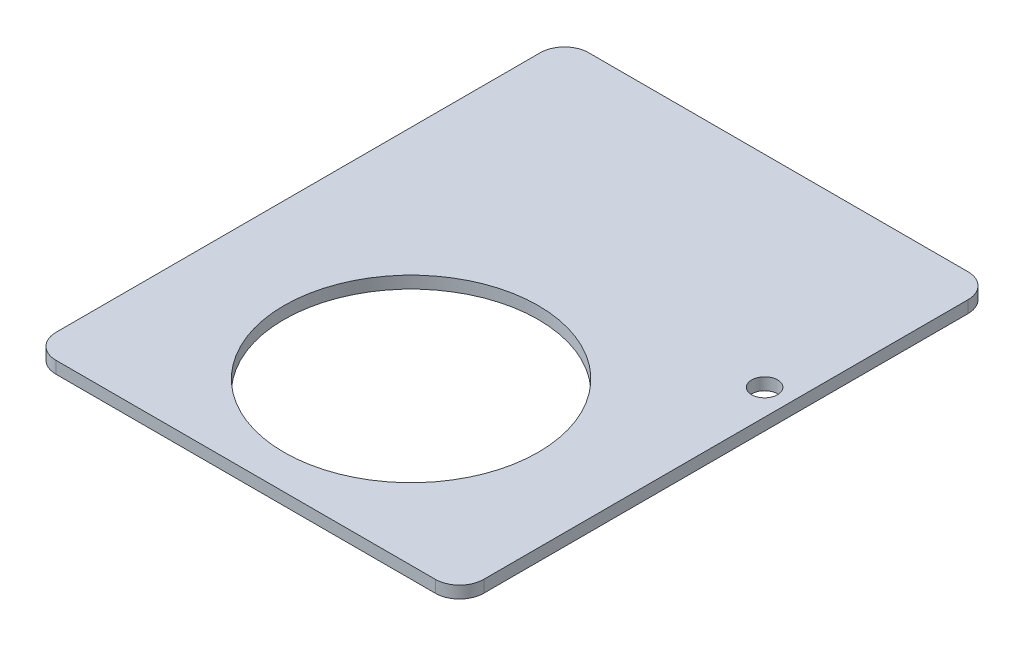
ISO-10303-21;
HEADER;
FILE_DESCRIPTION(('STEP AP214'),'2;1');
FILE_NAME('part.step','',(''),(''),'','','');
FILE_SCHEMA(('AUTOMOTIVE_DESIGN { 1 0 10303 214 1 1 1 1 }'));
ENDSEC;
DATA;
#1=APPLICATION_CONTEXT('core data for automotive mechanical design processes');
#2=APPLICATION_PROTOCOL_DEFINITION('international standard','automotive_design',2000,#1);
#3=PRODUCT_CONTEXT('',#1,'mechanical');
#4=PRODUCT('Part','Part','',(#3));
#5=PRODUCT_RELATED_PRODUCT_CATEGORY('part','',(#4));
#6=PRODUCT_DEFINITION_FORMATION('','',#4);
#7=PRODUCT_DEFINITION_CONTEXT('part definition',#1,'design');
#8=PRODUCT_DEFINITION('design','',#6,#7);
#9=PRODUCT_DEFINITION_SHAPE('','',#8);
#10=(LENGTH_UNIT() NAMED_UNIT(*) SI_UNIT(.MILLI.,.METRE.));
#11=(NAMED_UNIT(*) PLANE_ANGLE_UNIT() SI_UNIT($,.RADIAN.));
#12=(NAMED_UNIT(*) SI_UNIT($,.STERADIAN.) SOLID_ANGLE_UNIT());
#13=UNCERTAINTY_MEASURE_WITH_UNIT(LENGTH_MEASURE(1.E-05),#10,'distance_accuracy_value','');
#14=(GEOMETRIC_REPRESENTATION_CONTEXT(3) GLOBAL_UNCERTAINTY_ASSIGNED_CONTEXT((#13)) GLOBAL_UNIT_ASSIGNED_CONTEXT((#10,
#11,#12)) REPRESENTATION_CONTEXT('',''));
#15=CARTESIAN_POINT('',(0.,0.,0.));
#16=DIRECTION('',(0.,0.,1.));
#17=DIRECTION('',(1.,0.,0.));
#18=AXIS2_PLACEMENT_3D('',#15,#16,#17);
#19=CARTESIAN_POINT('',(-17.8909192247391,1.5,15.8487642961621));
#20=DIRECTION('',(0.,1.,0.));
#21=DIRECTION('',(0.,0.,1.));
#22=AXIS2_PLACEMENT_3D('',#19,#20,#21);
#23=PLANE('',#22);
#24=CARTESIAN_POINT('',(6.1090807752609,1.5,-1.15123570383793));
#25=DIRECTION('',(0.,1.,0.));
#26=DIRECTION('',(0.,0.,1.));
#27=AXIS2_PLACEMENT_3D('',#24,#25,#26);
#28=CIRCLE('',#27,15.75);
#29=CARTESIAN_POINT('',(6.1090807752609,1.5,14.5987642961621));
#30=VERTEX_POINT('',#29);
#31=EDGE_CURVE('E134',#30,#30,#28,.T.);
#32=ORIENTED_EDGE('',*,*,#31,.F.);
#33=EDGE_LOOP('',(#32));
#34=FACE_BOUND('',#33,.T.);
#35=CARTESIAN_POINT('',(-17.8909192247391,1.5,15.8487642961621));
#36=DIRECTION('',(0.,1.,0.));
#37=DIRECTION('',(0.,0.,1.));
#38=AXIS2_PLACEMENT_3D('',#35,#36,#37);
#39=CIRCLE('',#38,3.);
#40=CARTESIAN_POINT('',(-20.8909192247391,1.5,15.8487642961621));
#41=VERTEX_POINT('',#40);
#42=CARTESIAN_POINT('',(-17.8909192247391,1.5,18.8487642961621));
#43=VERTEX_POINT('',#42);
#44=EDGE_CURVE('E145',#41,#43,#39,.T.);
#45=ORIENTED_EDGE('',*,*,#44,.T.);
#46=DIRECTION('',(1.,0.,0.));
#47=VECTOR('',#46,1.);
#48=CARTESIAN_POINT('',(-17.8909192247391,1.5,18.8487642961621));
#49=LINE('',#48,#47);
#50=CARTESIAN_POINT('',(29.1090807752609,1.5,18.8487642961621));
#51=VERTEX_POINT('',#50);
#52=EDGE_CURVE('E93',#43,#51,#49,.T.);
#53=ORIENTED_EDGE('',*,*,#52,.T.);
#54=CARTESIAN_POINT('',(29.1090807752609,1.5,15.8487642961621));
#55=DIRECTION('',(0.,1.,0.));
#56=DIRECTION('',(0.,0.,1.));
#57=AXIS2_PLACEMENT_3D('',#54,#55,#56);
#58=CIRCLE('',#57,3.);
#59=CARTESIAN_POINT('',(32.1090807752609,1.5,15.8487642961621));
#60=VERTEX_POINT('',#59);
#61=EDGE_CURVE('E160',#51,#60,#58,.T.);
#62=ORIENTED_EDGE('',*,*,#61,.T.);
#63=DIRECTION('',(0.,0.,-1.));
#64=VECTOR('',#63,1.);
#65=CARTESIAN_POINT('',(32.1090807752609,1.5,-44.1512357038379));
#66=LINE('',#65,#64);
#67=CARTESIAN_POINT('',(32.1090807752609,1.5,-44.1512357038379));
#68=VERTEX_POINT('',#67);
#69=EDGE_CURVE('E173',#60,#68,#66,.T.);
#70=ORIENTED_EDGE('',*,*,#69,.T.);
#71=CARTESIAN_POINT('',(29.1090807752609,1.5,-44.1512357038379));
#72=DIRECTION('',(0.,1.,0.));
#73=DIRECTION('',(0.,0.,1.));
#74=AXIS2_PLACEMENT_3D('',#71,#72,#73);
#75=CIRCLE('',#74,3.);
#76=CARTESIAN_POINT('',(29.1090807752609,1.5,-47.1512357038379));
#77=VERTEX_POINT('',#76);
#78=EDGE_CURVE('E112',#68,#77,#75,.T.);
#79=ORIENTED_EDGE('',*,*,#78,.T.);
#80=DIRECTION('',(-1.,0.,0.));
#81=VECTOR('',#80,1.);
#82=CARTESIAN_POINT('',(-17.8909192247391,1.5,-47.1512357038379));
#83=LINE('',#82,#81);
#84=CARTESIAN_POINT('',(-17.8909192247391,1.5,-47.1512357038379));
#85=VERTEX_POINT('',#84);
#86=EDGE_CURVE('E106',#77,#85,#83,.T.);
#87=ORIENTED_EDGE('',*,*,#86,.T.);
#88=CARTESIAN_POINT('',(-17.8909192247391,1.5,-44.1512357038379));
#89=DIRECTION('',(0.,1.,0.));
#90=DIRECTION('',(0.,0.,1.));
#91=AXIS2_PLACEMENT_3D('',#88,#89,#90);
#92=CIRCLE('',#91,3.);
#93=CARTESIAN_POINT('',(-20.8909192247391,1.5,-44.1512357038379));
#94=VERTEX_POINT('',#93);
#95=EDGE_CURVE('E110',#85,#94,#92,.T.);
#96=ORIENTED_EDGE('',*,*,#95,.T.);
#97=DIRECTION('',(0.,0.,1.));
#98=VECTOR('',#97,1.);
#99=CARTESIAN_POINT('',(-20.8909192247391,1.5,-44.1512357038379));
#100=LINE('',#99,#98);
#101=EDGE_CURVE('E50',#94,#41,#100,.T.);
#102=ORIENTED_EDGE('',*,*,#101,.T.);
#103=EDGE_LOOP('',(#45,#53,#62,#70,#79,#87,#96,#102));
#104=FACE_BOUND('',#103,.T.);
#105=CARTESIAN_POINT('',(28.9090807752609,1.5,-22.1512357038379));
#106=DIRECTION('',(0.,1.,0.));
#107=DIRECTION('',(0.,0.,1.));
#108=AXIS2_PLACEMENT_3D('',#105,#106,#107);
#109=CIRCLE('',#108,1.60000000000001);
#110=CARTESIAN_POINT('',(28.9090807752609,1.5,-20.5512357038379));
#111=VERTEX_POINT('',#110);
#112=EDGE_CURVE('E182',#111,#111,#109,.T.);
#113=ORIENTED_EDGE('',*,*,#112,.F.);
#114=EDGE_LOOP('',(#113));
#115=FACE_BOUND('',#114,.T.);
#116=ADVANCED_FACE('F33',(#34,#104,#115),#23,.T.);
#117=CARTESIAN_POINT('',(-17.8909192247391,0.,15.8487642961621));
#118=DIRECTION('',(0.,1.,0.));
#119=DIRECTION('',(0.,0.,1.));
#120=AXIS2_PLACEMENT_3D('',#117,#118,#119);
#121=PLANE('',#120);
#122=CARTESIAN_POINT('',(-17.8909192247391,0.,15.8487642961621));
#123=DIRECTION('',(0.,1.,0.));
#124=DIRECTION('',(0.,0.,1.));
#125=AXIS2_PLACEMENT_3D('',#122,#123,#124);
#126=CIRCLE('',#125,3.);
#127=CARTESIAN_POINT('',(-20.8909192247391,0.,15.8487642961621));
#128=VERTEX_POINT('',#127);
#129=CARTESIAN_POINT('',(-17.8909192247391,0.,18.8487642961621));
#130=VERTEX_POINT('',#129);
#131=EDGE_CURVE('E130',#128,#130,#126,.T.);
#132=ORIENTED_EDGE('',*,*,#131,.F.);
#133=DIRECTION('',(0.,0.,1.));
#134=VECTOR('',#133,1.);
#135=CARTESIAN_POINT('',(-20.8909192247391,0.,-44.1512357038379));
#136=LINE('',#135,#134);
#137=CARTESIAN_POINT('',(-20.8909192247391,0.,-44.1512357038379));
#138=VERTEX_POINT('',#137);
#139=EDGE_CURVE('E85',#138,#128,#136,.T.);
#140=ORIENTED_EDGE('',*,*,#139,.F.);
#141=CARTESIAN_POINT('',(-17.8909192247391,0.,-44.1512357038379));
#142=DIRECTION('',(0.,1.,0.));
#143=DIRECTION('',(0.,0.,1.));
#144=AXIS2_PLACEMENT_3D('',#141,#142,#143);
#145=CIRCLE('',#144,3.);
#146=CARTESIAN_POINT('',(-17.8909192247391,0.,-47.1512357038379));
#147=VERTEX_POINT('',#146);
#148=EDGE_CURVE('E79',#147,#138,#145,.T.);
#149=ORIENTED_EDGE('',*,*,#148,.F.);
#150=DIRECTION('',(-1.,0.,0.));
#151=VECTOR('',#150,1.);
#152=CARTESIAN_POINT('',(-17.8909192247391,0.,-47.1512357038379));
#153=LINE('',#152,#151);
#154=CARTESIAN_POINT('',(29.1090807752609,0.,-47.1512357038379));
#155=VERTEX_POINT('',#154);
#156=EDGE_CURVE('E120',#155,#147,#153,.T.);
#157=ORIENTED_EDGE('',*,*,#156,.F.);
#158=CARTESIAN_POINT('',(29.1090807752609,0.,-44.1512357038379));
#159=DIRECTION('',(0.,1.,0.));
#160=DIRECTION('',(0.,0.,1.));
#161=AXIS2_PLACEMENT_3D('',#158,#159,#160);
#162=CIRCLE('',#161,3.);
#163=CARTESIAN_POINT('',(32.1090807752609,0.,-44.1512357038379));
#164=VERTEX_POINT('',#163);
#165=EDGE_CURVE('E140',#164,#155,#162,.T.);
#166=ORIENTED_EDGE('',*,*,#165,.F.);
#167=DIRECTION('',(0.,0.,-1.));
#168=VECTOR('',#167,1.);
#169=CARTESIAN_POINT('',(32.1090807752609,0.,-44.1512357038379));
#170=LINE('',#169,#168);
#171=CARTESIAN_POINT('',(32.1090807752609,0.,15.8487642961621));
#172=VERTEX_POINT('',#171);
#173=EDGE_CURVE('E138',#172,#164,#170,.T.);
#174=ORIENTED_EDGE('',*,*,#173,.F.);
#175=CARTESIAN_POINT('',(29.1090807752609,0.,15.8487642961621));
#176=DIRECTION('',(0.,1.,0.));
#177=DIRECTION('',(0.,0.,1.));
#178=AXIS2_PLACEMENT_3D('',#175,#176,#177);
#179=CIRCLE('',#178,3.);
#180=CARTESIAN_POINT('',(29.1090807752609,0.,18.8487642961621));
#181=VERTEX_POINT('',#180);
#182=EDGE_CURVE('E136',#181,#172,#179,.T.);
#183=ORIENTED_EDGE('',*,*,#182,.F.);
#184=DIRECTION('',(1.,0.,0.));
#185=VECTOR('',#184,1.);
#186=CARTESIAN_POINT('',(-17.8909192247391,0.,18.8487642961621));
#187=LINE('',#186,#185);
#188=EDGE_CURVE('E133',#130,#181,#187,.T.);
#189=ORIENTED_EDGE('',*,*,#188,.F.);
#190=EDGE_LOOP('',(#132,#140,#149,#157,#166,#174,#183,#189));
#191=FACE_BOUND('',#190,.T.);
#192=CARTESIAN_POINT('',(6.1090807752609,0.,-1.15123570383793));
#193=DIRECTION('',(0.,1.,0.));
#194=DIRECTION('',(0.,0.,1.));
#195=AXIS2_PLACEMENT_3D('',#192,#193,#194);
#196=CIRCLE('',#195,15.75);
#197=CARTESIAN_POINT('',(6.1090807752609,0.,14.5987642961621));
#198=VERTEX_POINT('',#197);
#199=EDGE_CURVE('E179',#198,#198,#196,.T.);
#200=ORIENTED_EDGE('',*,*,#199,.T.);
#201=EDGE_LOOP('',(#200));
#202=FACE_BOUND('',#201,.T.);
#203=CARTESIAN_POINT('',(28.9090807752609,0.,-22.1512357038379));
#204=DIRECTION('',(0.,1.,0.));
#205=DIRECTION('',(0.,0.,1.));
#206=AXIS2_PLACEMENT_3D('',#203,#204,#205);
#207=CIRCLE('',#206,1.60000000000001);
#208=CARTESIAN_POINT('',(28.9090807752609,0.,-20.5512357038379));
#209=VERTEX_POINT('',#208);
#210=EDGE_CURVE('E185',#209,#209,#207,.T.);
#211=ORIENTED_EDGE('',*,*,#210,.T.);
#212=EDGE_LOOP('',(#211));
#213=FACE_BOUND('',#212,.T.);
#214=ADVANCED_FACE('F164',(#191,#202,#213),#121,.F.);
#215=CARTESIAN_POINT('',(-17.8909192247391,1.5,15.8487642961621));
#216=DIRECTION('',(0.,-1.,0.));
#217=DIRECTION('',(0.,0.,-1.));
#218=AXIS2_PLACEMENT_3D('',#215,#216,#217);
#219=CYLINDRICAL_SURFACE('',#218,3.);
#220=ORIENTED_EDGE('',*,*,#131,.T.);
#221=DIRECTION('',(0.,-1.,0.));
#222=VECTOR('',#221,1.);
#223=CARTESIAN_POINT('',(-17.8909192247391,1.5,18.8487642961621));
#224=LINE('',#223,#222);
#225=EDGE_CURVE('E11',#43,#130,#224,.T.);
#226=ORIENTED_EDGE('',*,*,#225,.F.);
#227=ORIENTED_EDGE('',*,*,#44,.F.);
#228=DIRECTION('',(0.,-1.,0.));
#229=VECTOR('',#228,1.);
#230=CARTESIAN_POINT('',(-20.8909192247391,1.5,15.8487642961621));
#231=LINE('',#230,#229);
#232=EDGE_CURVE('E126',#41,#128,#231,.T.);
#233=ORIENTED_EDGE('',*,*,#232,.T.);
#234=EDGE_LOOP('',(#220,#226,#227,#233));
#235=FACE_BOUND('',#234,.T.);
#236=ADVANCED_FACE('F35',(#235),#219,.T.);
#237=CARTESIAN_POINT('',(-17.8909192247391,1.5,18.8487642961621));
#238=DIRECTION('',(0.,0.,-1.));
#239=DIRECTION('',(-1.,0.,0.));
#240=AXIS2_PLACEMENT_3D('',#237,#238,#239);
#241=PLANE('',#240);
#242=ORIENTED_EDGE('',*,*,#188,.T.);
#243=DIRECTION('',(0.,-1.,0.));
#244=VECTOR('',#243,1.);
#245=CARTESIAN_POINT('',(29.1090807752609,1.5,18.8487642961621));
#246=LINE('',#245,#244);
#247=EDGE_CURVE('E42',#51,#181,#246,.T.);
#248=ORIENTED_EDGE('',*,*,#247,.F.);
#249=ORIENTED_EDGE('',*,*,#52,.F.);
#250=ORIENTED_EDGE('',*,*,#225,.T.);
#251=EDGE_LOOP('',(#242,#248,#249,#250));
#252=FACE_BOUND('',#251,.T.);
#253=ADVANCED_FACE('F217',(#252),#241,.F.);
#254=CARTESIAN_POINT('',(29.1090807752609,1.5,15.8487642961621));
#255=DIRECTION('',(0.,-1.,0.));
#256=DIRECTION('',(0.,0.,-1.));
#257=AXIS2_PLACEMENT_3D('',#254,#255,#256);
#258=CYLINDRICAL_SURFACE('',#257,3.);
#259=ORIENTED_EDGE('',*,*,#182,.T.);
#260=DIRECTION('',(0.,-1.,0.));
#261=VECTOR('',#260,1.);
#262=CARTESIAN_POINT('',(32.1090807752609,1.5,15.8487642961621));
#263=LINE('',#262,#261);
#264=EDGE_CURVE('E152',#60,#172,#263,.T.);
#265=ORIENTED_EDGE('',*,*,#264,.F.);
#266=ORIENTED_EDGE('',*,*,#61,.F.);
#267=ORIENTED_EDGE('',*,*,#247,.T.);
#268=EDGE_LOOP('',(#259,#265,#266,#267));
#269=FACE_BOUND('',#268,.T.);
#270=ADVANCED_FACE('F158',(#269),#258,.T.);
#271=CARTESIAN_POINT('',(32.1090807752609,1.5,-44.1512357038379));
#272=DIRECTION('',(-1.,0.,0.));
#273=DIRECTION('',(0.,0.,1.));
#274=AXIS2_PLACEMENT_3D('',#271,#272,#273);
#275=PLANE('',#274);
#276=ORIENTED_EDGE('',*,*,#173,.T.);
#277=DIRECTION('',(0.,-1.,0.));
#278=VECTOR('',#277,1.);
#279=CARTESIAN_POINT('',(32.1090807752609,1.5,-44.1512357038379));
#280=LINE('',#279,#278);
#281=EDGE_CURVE('E149',#68,#164,#280,.T.);
#282=ORIENTED_EDGE('',*,*,#281,.F.);
#283=ORIENTED_EDGE('',*,*,#69,.F.);
#284=ORIENTED_EDGE('',*,*,#264,.T.);
#285=EDGE_LOOP('',(#276,#282,#283,#284));
#286=FACE_BOUND('',#285,.T.);
#287=ADVANCED_FACE('F169',(#286),#275,.F.);
#288=CARTESIAN_POINT('',(29.1090807752609,1.5,-44.1512357038379));
#289=DIRECTION('',(0.,-1.,0.));
#290=DIRECTION('',(0.,0.,-1.));
#291=AXIS2_PLACEMENT_3D('',#288,#289,#290);
#292=CYLINDRICAL_SURFACE('',#291,3.);
#293=ORIENTED_EDGE('',*,*,#165,.T.);
#294=DIRECTION('',(0.,-1.,0.));
#295=VECTOR('',#294,1.);
#296=CARTESIAN_POINT('',(29.1090807752609,1.5,-47.1512357038379));
#297=LINE('',#296,#295);
#298=EDGE_CURVE('E121',#77,#155,#297,.T.);
#299=ORIENTED_EDGE('',*,*,#298,.F.);
#300=ORIENTED_EDGE('',*,*,#78,.F.);
#301=ORIENTED_EDGE('',*,*,#281,.T.);
#302=EDGE_LOOP('',(#293,#299,#300,#301));
#303=FACE_BOUND('',#302,.T.);
#304=ADVANCED_FACE('F172',(#303),#292,.T.);
#305=CARTESIAN_POINT('',(-17.8909192247391,1.5,-47.1512357038379));
#306=DIRECTION('',(0.,0.,1.));
#307=DIRECTION('',(1.,0.,0.));
#308=AXIS2_PLACEMENT_3D('',#305,#306,#307);
#309=PLANE('',#308);
#310=ORIENTED_EDGE('',*,*,#156,.T.);
#311=DIRECTION('',(0.,-1.,0.));
#312=VECTOR('',#311,1.);
#313=CARTESIAN_POINT('',(-17.8909192247391,1.5,-47.1512357038379));
#314=LINE('',#313,#312);
#315=EDGE_CURVE('E117',#85,#147,#314,.T.);
#316=ORIENTED_EDGE('',*,*,#315,.F.);
#317=ORIENTED_EDGE('',*,*,#86,.F.);
#318=ORIENTED_EDGE('',*,*,#298,.T.);
#319=EDGE_LOOP('',(#310,#316,#317,#318));
#320=FACE_BOUND('',#319,.T.);
#321=ADVANCED_FACE('F118',(#320),#309,.F.);
#322=CARTESIAN_POINT('',(-17.8909192247391,1.5,-44.1512357038379));
#323=DIRECTION('',(0.,-1.,0.));
#324=DIRECTION('',(0.,0.,-1.));
#325=AXIS2_PLACEMENT_3D('',#322,#323,#324);
#326=CYLINDRICAL_SURFACE('',#325,3.);
#327=ORIENTED_EDGE('',*,*,#148,.T.);
#328=DIRECTION('',(0.,-1.,0.));
#329=VECTOR('',#328,1.);
#330=CARTESIAN_POINT('',(-20.8909192247391,1.5,-44.1512357038379));
#331=LINE('',#330,#329);
#332=EDGE_CURVE('E122',#94,#138,#331,.T.);
#333=ORIENTED_EDGE('',*,*,#332,.F.);
#334=ORIENTED_EDGE('',*,*,#95,.F.);
#335=ORIENTED_EDGE('',*,*,#315,.T.);
#336=EDGE_LOOP('',(#327,#333,#334,#335));
#337=FACE_BOUND('',#336,.T.);
#338=ADVANCED_FACE('F124',(#337),#326,.T.);
#339=CARTESIAN_POINT('',(-20.8909192247391,1.5,-44.1512357038379));
#340=DIRECTION('',(1.,0.,0.));
#341=DIRECTION('',(0.,0.,-1.));
#342=AXIS2_PLACEMENT_3D('',#339,#340,#341);
#343=PLANE('',#342);
#344=ORIENTED_EDGE('',*,*,#139,.T.);
#345=ORIENTED_EDGE('',*,*,#232,.F.);
#346=ORIENTED_EDGE('',*,*,#101,.F.);
#347=ORIENTED_EDGE('',*,*,#332,.T.);
#348=EDGE_LOOP('',(#344,#345,#346,#347));
#349=FACE_BOUND('',#348,.T.);
#350=ADVANCED_FACE('F205',(#349),#343,.F.);
#351=CARTESIAN_POINT('',(6.1090807752609,1.5,-1.15123570383793));
#352=DIRECTION('',(0.,-1.,0.));
#353=DIRECTION('',(0.,0.,-1.));
#354=AXIS2_PLACEMENT_3D('',#351,#352,#353);
#355=CYLINDRICAL_SURFACE('',#354,15.75);
#356=ORIENTED_EDGE('',*,*,#31,.T.);
#357=EDGE_LOOP('',(#356));
#358=FACE_BOUND('',#357,.T.);
#359=ORIENTED_EDGE('',*,*,#199,.F.);
#360=EDGE_LOOP('',(#359));
#361=FACE_BOUND('',#360,.T.);
#362=ADVANCED_FACE('F202',(#358,#361),#355,.F.);
#363=CARTESIAN_POINT('',(28.9090807752609,1.5,-22.1512357038379));
#364=DIRECTION('',(0.,-1.,0.));
#365=DIRECTION('',(0.,0.,-1.));
#366=AXIS2_PLACEMENT_3D('',#363,#364,#365);
#367=CYLINDRICAL_SURFACE('',#366,1.60000000000001);
#368=ORIENTED_EDGE('',*,*,#112,.T.);
#369=EDGE_LOOP('',(#368));
#370=FACE_BOUND('',#369,.T.);
#371=ORIENTED_EDGE('',*,*,#210,.F.);
#372=EDGE_LOOP('',(#371));
#373=FACE_BOUND('',#372,.T.);
#374=ADVANCED_FACE('F191',(#370,#373),#367,.F.);
#375=CLOSED_SHELL('',(#116,#214,#236,#253,#270,#287,#304,#321,#338,#350,#362,#374));
#376=MANIFOLD_SOLID_BREP('B2',#375);
#377=ADVANCED_BREP_SHAPE_REPRESENTATION('',(#18,#376),#14);
#378=SHAPE_DEFINITION_REPRESENTATION(#9,#377);
ENDSEC;
END-ISO-10303-21;
